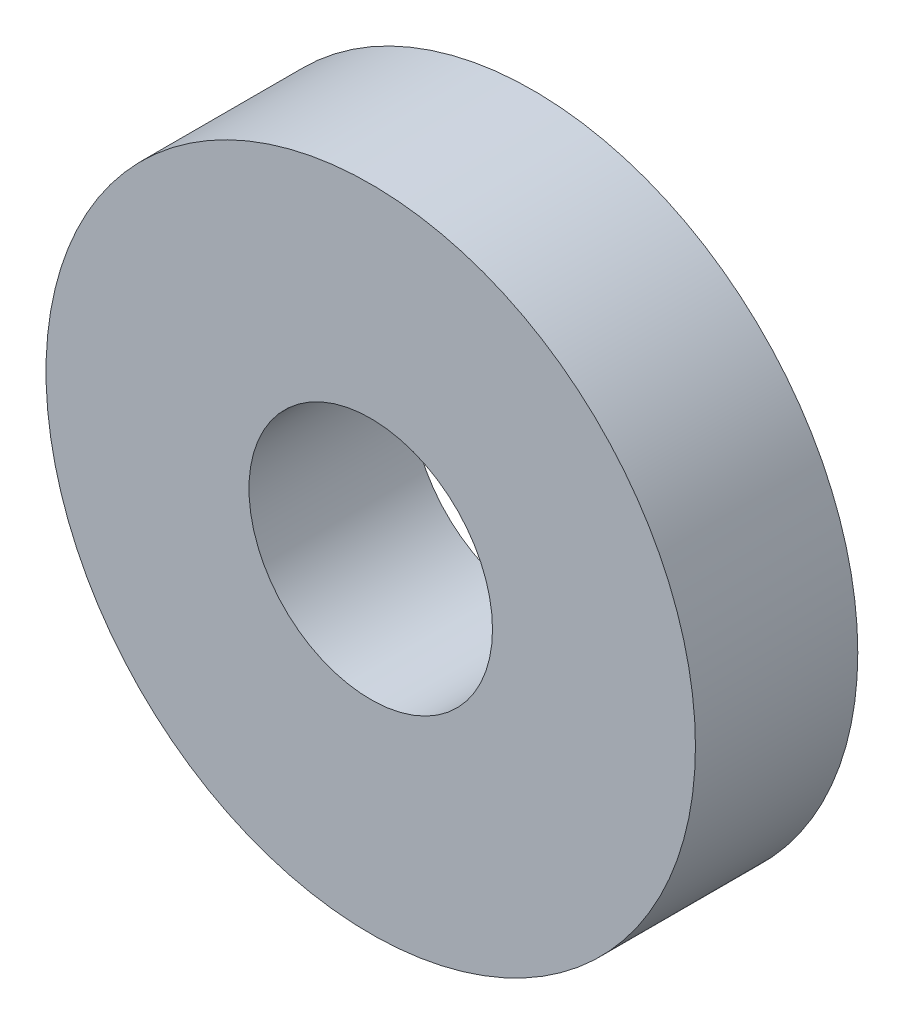
ISO-10303-21;
HEADER;
FILE_DESCRIPTION(('STEP AP214'),'2;1');
FILE_NAME('part.step','',(''),(''),'','','');
FILE_SCHEMA(('AUTOMOTIVE_DESIGN { 1 0 10303 214 1 1 1 1 }'));
ENDSEC;
DATA;
#1=APPLICATION_CONTEXT('core data for automotive mechanical design processes');
#2=APPLICATION_PROTOCOL_DEFINITION('international standard','automotive_design',2000,#1);
#3=PRODUCT_CONTEXT('',#1,'mechanical');
#4=PRODUCT('Part','Part','',(#3));
#5=PRODUCT_RELATED_PRODUCT_CATEGORY('part','',(#4));
#6=PRODUCT_DEFINITION_FORMATION('','',#4);
#7=PRODUCT_DEFINITION_CONTEXT('part definition',#1,'design');
#8=PRODUCT_DEFINITION('design','',#6,#7);
#9=PRODUCT_DEFINITION_SHAPE('','',#8);
#10=(LENGTH_UNIT() NAMED_UNIT(*) SI_UNIT(.MILLI.,.METRE.));
#11=(NAMED_UNIT(*) PLANE_ANGLE_UNIT() SI_UNIT($,.RADIAN.));
#12=(NAMED_UNIT(*) SI_UNIT($,.STERADIAN.) SOLID_ANGLE_UNIT());
#13=UNCERTAINTY_MEASURE_WITH_UNIT(LENGTH_MEASURE(1.E-05),#10,'distance_accuracy_value','');
#14=(GEOMETRIC_REPRESENTATION_CONTEXT(3) GLOBAL_UNCERTAINTY_ASSIGNED_CONTEXT((#13)) GLOBAL_UNIT_ASSIGNED_CONTEXT((#10,
#11,#12)) REPRESENTATION_CONTEXT('',''));
#15=CARTESIAN_POINT('',(0.,0.,0.));
#16=DIRECTION('',(0.,0.,1.));
#17=DIRECTION('',(1.,0.,0.));
#18=AXIS2_PLACEMENT_3D('',#15,#16,#17);
#19=CARTESIAN_POINT('',(0.,0.,5.));
#20=DIRECTION('',(0.,0.,1.));
#21=DIRECTION('',(1.,0.,0.));
#22=AXIS2_PLACEMENT_3D('',#19,#20,#21);
#23=PLANE('',#22);
#24=CARTESIAN_POINT('',(0.,0.,5.));
#25=DIRECTION('',(0.,0.,1.));
#26=DIRECTION('',(1.,0.,0.));
#27=AXIS2_PLACEMENT_3D('',#24,#25,#26);
#28=CIRCLE('',#27,20.);
#29=CARTESIAN_POINT('',(20.,0.,5.));
#30=VERTEX_POINT('',#29);
#31=EDGE_CURVE('E10',#30,#30,#28,.T.);
#32=ORIENTED_EDGE('',*,*,#31,.T.);
#33=EDGE_LOOP('',(#32));
#34=FACE_BOUND('',#33,.T.);
#35=CARTESIAN_POINT('',(0.,0.,5.));
#36=DIRECTION('',(0.,0.,1.));
#37=DIRECTION('',(1.,0.,0.));
#38=AXIS2_PLACEMENT_3D('',#35,#36,#37);
#39=CIRCLE('',#38,7.5);
#40=CARTESIAN_POINT('',(7.5,0.,5.));
#41=VERTEX_POINT('',#40);
#42=EDGE_CURVE('E52',#41,#41,#39,.T.);
#43=ORIENTED_EDGE('',*,*,#42,.F.);
#44=EDGE_LOOP('',(#43));
#45=FACE_BOUND('',#44,.T.);
#46=ADVANCED_FACE('F41',(#34,#45),#23,.T.);
#47=CARTESIAN_POINT('',(0.,0.,-5.));
#48=DIRECTION('',(0.,0.,1.));
#49=DIRECTION('',(1.,0.,0.));
#50=AXIS2_PLACEMENT_3D('',#47,#48,#49);
#51=PLANE('',#50);
#52=CARTESIAN_POINT('',(0.,0.,-5.));
#53=DIRECTION('',(0.,0.,1.));
#54=DIRECTION('',(1.,0.,0.));
#55=AXIS2_PLACEMENT_3D('',#52,#53,#54);
#56=CIRCLE('',#55,20.);
#57=CARTESIAN_POINT('',(20.,0.,-5.));
#58=VERTEX_POINT('',#57);
#59=EDGE_CURVE('E45',#58,#58,#56,.T.);
#60=ORIENTED_EDGE('',*,*,#59,.F.);
#61=EDGE_LOOP('',(#60));
#62=FACE_BOUND('',#61,.T.);
#63=CARTESIAN_POINT('',(0.,0.,-5.));
#64=DIRECTION('',(0.,0.,1.));
#65=DIRECTION('',(1.,0.,0.));
#66=AXIS2_PLACEMENT_3D('',#63,#64,#65);
#67=CIRCLE('',#66,7.5);
#68=CARTESIAN_POINT('',(7.5,0.,-5.));
#69=VERTEX_POINT('',#68);
#70=EDGE_CURVE('E54',#69,#69,#67,.T.);
#71=ORIENTED_EDGE('',*,*,#70,.T.);
#72=EDGE_LOOP('',(#71));
#73=FACE_BOUND('',#72,.T.);
#74=ADVANCED_FACE('F64',(#62,#73),#51,.F.);
#75=CARTESIAN_POINT('',(0.,0.,5.));
#76=DIRECTION('',(0.,0.,-1.));
#77=DIRECTION('',(-1.,0.,0.));
#78=AXIS2_PLACEMENT_3D('',#75,#76,#77);
#79=CYLINDRICAL_SURFACE('',#78,20.);
#80=ORIENTED_EDGE('',*,*,#31,.F.);
#81=EDGE_LOOP('',(#80));
#82=FACE_BOUND('',#81,.T.);
#83=ORIENTED_EDGE('',*,*,#59,.T.);
#84=EDGE_LOOP('',(#83));
#85=FACE_BOUND('',#84,.T.);
#86=ADVANCED_FACE('F43',(#82,#85),#79,.T.);
#87=CARTESIAN_POINT('',(0.,0.,5.));
#88=DIRECTION('',(0.,0.,-1.));
#89=DIRECTION('',(-1.,0.,0.));
#90=AXIS2_PLACEMENT_3D('',#87,#88,#89);
#91=CYLINDRICAL_SURFACE('',#90,7.5);
#92=ORIENTED_EDGE('',*,*,#42,.T.);
#93=EDGE_LOOP('',(#92));
#94=FACE_BOUND('',#93,.T.);
#95=ORIENTED_EDGE('',*,*,#70,.F.);
#96=EDGE_LOOP('',(#95));
#97=FACE_BOUND('',#96,.T.);
#98=ADVANCED_FACE('F60',(#94,#97),#91,.F.);
#99=CLOSED_SHELL('',(#46,#74,#86,#98));
#100=MANIFOLD_SOLID_BREP('B2',#99);
#101=ADVANCED_BREP_SHAPE_REPRESENTATION('',(#18,#100),#14);
#102=SHAPE_DEFINITION_REPRESENTATION(#9,#101);
ENDSEC;
END-ISO-10303-21;
